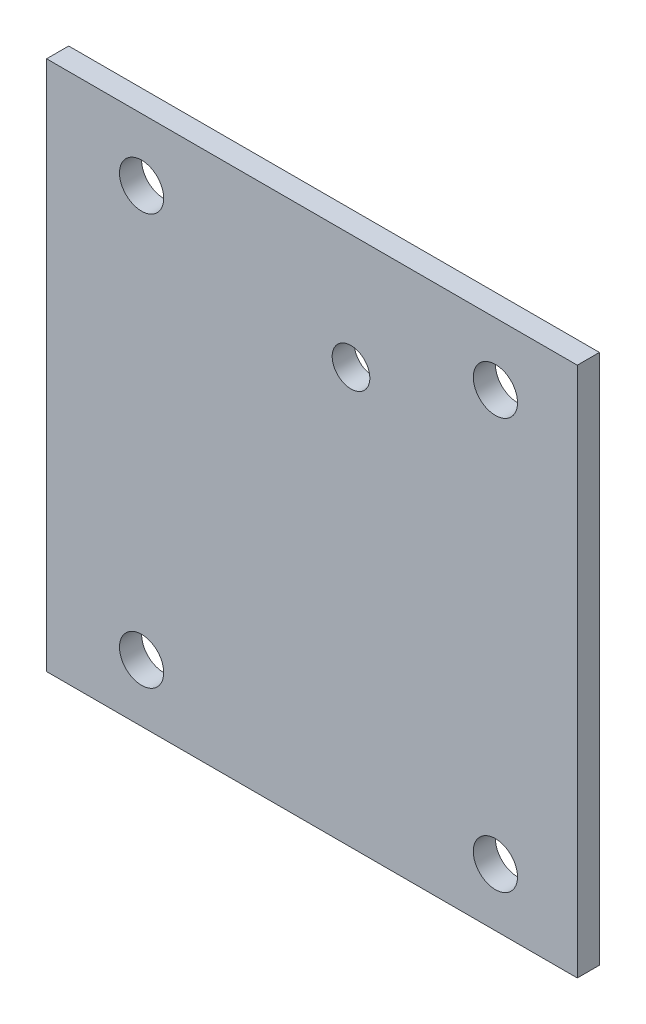
ISO-10303-21;
HEADER;
FILE_DESCRIPTION(('STEP AP214'),'2;1');
FILE_NAME('part.step','',(''),(''),'','','');
FILE_SCHEMA(('AUTOMOTIVE_DESIGN { 1 0 10303 214 1 1 1 1 }'));
ENDSEC;
DATA;
#1=APPLICATION_CONTEXT('core data for automotive mechanical design processes');
#2=APPLICATION_PROTOCOL_DEFINITION('international standard','automotive_design',2000,#1);
#3=PRODUCT_CONTEXT('',#1,'mechanical');
#4=PRODUCT('Part','Part','',(#3));
#5=PRODUCT_RELATED_PRODUCT_CATEGORY('part','',(#4));
#6=PRODUCT_DEFINITION_FORMATION('','',#4);
#7=PRODUCT_DEFINITION_CONTEXT('part definition',#1,'design');
#8=PRODUCT_DEFINITION('design','',#6,#7);
#9=PRODUCT_DEFINITION_SHAPE('','',#8);
#10=(LENGTH_UNIT() NAMED_UNIT(*) SI_UNIT(.MILLI.,.METRE.));
#11=(NAMED_UNIT(*) PLANE_ANGLE_UNIT() SI_UNIT($,.RADIAN.));
#12=(NAMED_UNIT(*) SI_UNIT($,.STERADIAN.) SOLID_ANGLE_UNIT());
#13=UNCERTAINTY_MEASURE_WITH_UNIT(LENGTH_MEASURE(1.E-05),#10,'distance_accuracy_value','');
#14=(GEOMETRIC_REPRESENTATION_CONTEXT(3) GLOBAL_UNCERTAINTY_ASSIGNED_CONTEXT((#13)) GLOBAL_UNIT_ASSIGNED_CONTEXT((#10,
#11,#12)) REPRESENTATION_CONTEXT('',''));
#15=CARTESIAN_POINT('',(0.,0.,0.));
#16=DIRECTION('',(0.,0.,1.));
#17=DIRECTION('',(1.,0.,0.));
#18=AXIS2_PLACEMENT_3D('',#15,#16,#17);
#19=CARTESIAN_POINT('',(0.,0.,3.175));
#20=DIRECTION('',(0.,0.,-1.));
#21=DIRECTION('',(-1.,0.,0.));
#22=AXIS2_PLACEMENT_3D('',#19,#20,#21);
#23=PLANE('',#22);
#24=CARTESIAN_POINT('',(55.467721899996,287.273383219132,3.175));
#25=DIRECTION('',(0.,0.,1.));
#26=DIRECTION('',(1.,0.,0.));
#27=AXIS2_PLACEMENT_3D('',#24,#25,#26);
#28=CIRCLE('',#27,2.7051);
#29=CARTESIAN_POINT('',(58.172821899996,287.273383219132,3.175));
#30=VERTEX_POINT('',#29);
#31=EDGE_CURVE('E144',#30,#30,#28,.T.);
#32=ORIENTED_EDGE('',*,*,#31,.F.);
#33=EDGE_LOOP('',(#32));
#34=FACE_BOUND('',#33,.T.);
#35=DIRECTION('',(0.,1.,0.));
#36=VECTOR('',#35,1.);
#37=CARTESIAN_POINT('',(87.9593052995791,303.776157482236,3.175));
#38=LINE('',#37,#36);
#39=CARTESIAN_POINT('',(87.9593052995791,227.576157482236,3.175));
#40=VERTEX_POINT('',#39);
#41=CARTESIAN_POINT('',(87.9593052995791,303.776157482236,3.175));
#42=VERTEX_POINT('',#41);
#43=EDGE_CURVE('E91',#40,#42,#38,.T.);
#44=ORIENTED_EDGE('',*,*,#43,.T.);
#45=DIRECTION('',(-1.,0.,0.));
#46=VECTOR('',#45,1.);
#47=CARTESIAN_POINT('',(87.9593052995791,303.776157482236,3.175));
#48=LINE('',#47,#46);
#49=CARTESIAN_POINT('',(11.7593052995791,303.776157482236,3.175));
#50=VERTEX_POINT('',#49);
#51=EDGE_CURVE('E86',#42,#50,#48,.T.);
#52=ORIENTED_EDGE('',*,*,#51,.T.);
#53=DIRECTION('',(0.,-1.,0.));
#54=VECTOR('',#53,1.);
#55=CARTESIAN_POINT('',(11.7593052995791,303.776157482236,3.175));
#56=LINE('',#55,#54);
#57=CARTESIAN_POINT('',(11.7593052995791,227.576157482236,3.175));
#58=VERTEX_POINT('',#57);
#59=EDGE_CURVE('E89',#50,#58,#56,.T.);
#60=ORIENTED_EDGE('',*,*,#59,.T.);
#61=DIRECTION('',(1.,0.,0.));
#62=VECTOR('',#61,1.);
#63=CARTESIAN_POINT('',(87.9593052995791,227.576157482236,3.175));
#64=LINE('',#63,#62);
#65=EDGE_CURVE('E56',#58,#40,#64,.T.);
#66=ORIENTED_EDGE('',*,*,#65,.T.);
#67=EDGE_LOOP('',(#44,#52,#60,#66));
#68=FACE_BOUND('',#67,.T.);
#69=CARTESIAN_POINT('',(25.3999999999992,235.857142857143,3.175));
#70=DIRECTION('',(0.,0.,1.));
#71=DIRECTION('',(1.,0.,0.));
#72=AXIS2_PLACEMENT_3D('',#69,#70,#71);
#73=CIRCLE('',#72,3.17500000000001);
#74=CARTESIAN_POINT('',(28.5749999999992,235.857142857143,3.175));
#75=VERTEX_POINT('',#74);
#76=EDGE_CURVE('E106',#75,#75,#73,.T.);
#77=ORIENTED_EDGE('',*,*,#76,.F.);
#78=EDGE_LOOP('',(#77));
#79=FACE_BOUND('',#78,.T.);
#80=CARTESIAN_POINT('',(25.399999999999,294.821428571429,3.175));
#81=DIRECTION('',(0.,0.,1.));
#82=DIRECTION('',(1.,0.,0.));
#83=AXIS2_PLACEMENT_3D('',#80,#81,#82);
#84=CIRCLE('',#83,3.17499999999996);
#85=CARTESIAN_POINT('',(28.5749999999989,294.821428571429,3.175));
#86=VERTEX_POINT('',#85);
#87=EDGE_CURVE('E121',#86,#86,#84,.T.);
#88=ORIENTED_EDGE('',*,*,#87,.F.);
#89=EDGE_LOOP('',(#88));
#90=FACE_BOUND('',#89,.T.);
#91=CARTESIAN_POINT('',(76.1999999999992,235.857142857144,3.175));
#92=DIRECTION('',(0.,0.,1.));
#93=DIRECTION('',(1.,0.,0.));
#94=AXIS2_PLACEMENT_3D('',#91,#92,#93);
#95=CIRCLE('',#94,3.175);
#96=CARTESIAN_POINT('',(79.3749999999992,235.857142857144,3.175));
#97=VERTEX_POINT('',#96);
#98=EDGE_CURVE('E127',#97,#97,#95,.T.);
#99=ORIENTED_EDGE('',*,*,#98,.F.);
#100=EDGE_LOOP('',(#99));
#101=FACE_BOUND('',#100,.T.);
#102=CARTESIAN_POINT('',(76.199999999999,294.821428571429,3.175));
#103=DIRECTION('',(0.,0.,1.));
#104=DIRECTION('',(1.,0.,0.));
#105=AXIS2_PLACEMENT_3D('',#102,#103,#104);
#106=CIRCLE('',#105,3.17499999999998);
#107=CARTESIAN_POINT('',(79.374999999999,294.821428571429,3.175));
#108=VERTEX_POINT('',#107);
#109=EDGE_CURVE('E133',#108,#108,#106,.T.);
#110=ORIENTED_EDGE('',*,*,#109,.F.);
#111=EDGE_LOOP('',(#110));
#112=FACE_BOUND('',#111,.T.);
#113=ADVANCED_FACE('F39',(#34,#68,#79,#90,#101,#112),#23,.F.);
#114=CARTESIAN_POINT('',(0.,0.,0.));
#115=DIRECTION('',(0.,0.,-1.));
#116=DIRECTION('',(-1.,0.,0.));
#117=AXIS2_PLACEMENT_3D('',#114,#115,#116);
#118=PLANE('',#117);
#119=CARTESIAN_POINT('',(55.467721899996,287.273383219132,0.));
#120=DIRECTION('',(0.,0.,1.));
#121=DIRECTION('',(1.,0.,0.));
#122=AXIS2_PLACEMENT_3D('',#119,#120,#121);
#123=CIRCLE('',#122,2.7051);
#124=CARTESIAN_POINT('',(58.172821899996,287.273383219132,0.));
#125=VERTEX_POINT('',#124);
#126=EDGE_CURVE('E139',#125,#125,#123,.T.);
#127=ORIENTED_EDGE('',*,*,#126,.T.);
#128=EDGE_LOOP('',(#127));
#129=FACE_BOUND('',#128,.T.);
#130=CARTESIAN_POINT('',(76.1999999999992,235.857142857144,0.));
#131=DIRECTION('',(0.,0.,1.));
#132=DIRECTION('',(1.,0.,0.));
#133=AXIS2_PLACEMENT_3D('',#130,#131,#132);
#134=CIRCLE('',#133,3.175);
#135=CARTESIAN_POINT('',(79.3749999999992,235.857142857144,0.));
#136=VERTEX_POINT('',#135);
#137=EDGE_CURVE('E130',#136,#136,#134,.T.);
#138=ORIENTED_EDGE('',*,*,#137,.T.);
#139=EDGE_LOOP('',(#138));
#140=FACE_BOUND('',#139,.T.);
#141=CARTESIAN_POINT('',(25.3999999999992,235.857142857143,0.));
#142=DIRECTION('',(0.,0.,1.));
#143=DIRECTION('',(1.,0.,0.));
#144=AXIS2_PLACEMENT_3D('',#141,#142,#143);
#145=CIRCLE('',#144,3.17500000000001);
#146=CARTESIAN_POINT('',(28.5749999999992,235.857142857143,0.));
#147=VERTEX_POINT('',#146);
#148=EDGE_CURVE('E118',#147,#147,#145,.T.);
#149=ORIENTED_EDGE('',*,*,#148,.T.);
#150=EDGE_LOOP('',(#149));
#151=FACE_BOUND('',#150,.T.);
#152=DIRECTION('',(0.,1.,0.));
#153=VECTOR('',#152,1.);
#154=CARTESIAN_POINT('',(87.9593052995791,303.776157482236,0.));
#155=LINE('',#154,#153);
#156=CARTESIAN_POINT('',(87.9593052995791,227.576157482236,0.));
#157=VERTEX_POINT('',#156);
#158=CARTESIAN_POINT('',(87.9593052995791,303.776157482236,0.));
#159=VERTEX_POINT('',#158);
#160=EDGE_CURVE('E103',#157,#159,#155,.T.);
#161=ORIENTED_EDGE('',*,*,#160,.F.);
#162=DIRECTION('',(1.,0.,0.));
#163=VECTOR('',#162,1.);
#164=CARTESIAN_POINT('',(87.9593052995791,227.576157482236,0.));
#165=LINE('',#164,#163);
#166=CARTESIAN_POINT('',(11.7593052995791,227.576157482236,0.));
#167=VERTEX_POINT('',#166);
#168=EDGE_CURVE('E79',#167,#157,#165,.T.);
#169=ORIENTED_EDGE('',*,*,#168,.F.);
#170=DIRECTION('',(0.,-1.,0.));
#171=VECTOR('',#170,1.);
#172=CARTESIAN_POINT('',(11.7593052995791,303.776157482236,0.));
#173=LINE('',#172,#171);
#174=CARTESIAN_POINT('',(11.7593052995791,303.776157482236,0.));
#175=VERTEX_POINT('',#174);
#176=EDGE_CURVE('E73',#175,#167,#173,.T.);
#177=ORIENTED_EDGE('',*,*,#176,.F.);
#178=DIRECTION('',(-1.,0.,0.));
#179=VECTOR('',#178,1.);
#180=CARTESIAN_POINT('',(87.9593052995791,303.776157482236,0.));
#181=LINE('',#180,#179);
#182=EDGE_CURVE('E95',#159,#175,#181,.T.);
#183=ORIENTED_EDGE('',*,*,#182,.F.);
#184=EDGE_LOOP('',(#161,#169,#177,#183));
#185=FACE_BOUND('',#184,.T.);
#186=CARTESIAN_POINT('',(25.399999999999,294.821428571429,0.));
#187=DIRECTION('',(0.,0.,1.));
#188=DIRECTION('',(1.,0.,0.));
#189=AXIS2_PLACEMENT_3D('',#186,#187,#188);
#190=CIRCLE('',#189,3.17499999999996);
#191=CARTESIAN_POINT('',(28.5749999999989,294.821428571429,0.));
#192=VERTEX_POINT('',#191);
#193=EDGE_CURVE('E124',#192,#192,#190,.T.);
#194=ORIENTED_EDGE('',*,*,#193,.T.);
#195=EDGE_LOOP('',(#194));
#196=FACE_BOUND('',#195,.T.);
#197=CARTESIAN_POINT('',(76.199999999999,294.821428571429,0.));
#198=DIRECTION('',(0.,0.,1.));
#199=DIRECTION('',(1.,0.,0.));
#200=AXIS2_PLACEMENT_3D('',#197,#198,#199);
#201=CIRCLE('',#200,3.17499999999998);
#202=CARTESIAN_POINT('',(79.374999999999,294.821428571429,0.));
#203=VERTEX_POINT('',#202);
#204=EDGE_CURVE('E136',#203,#203,#201,.T.);
#205=ORIENTED_EDGE('',*,*,#204,.T.);
#206=EDGE_LOOP('',(#205));
#207=FACE_BOUND('',#206,.T.);
#208=ADVANCED_FACE('F114',(#129,#140,#151,#185,#196,#207),#118,.T.);
#209=CARTESIAN_POINT('',(87.9593052995791,303.776157482236,3.175));
#210=DIRECTION('',(-1.,0.,0.));
#211=DIRECTION('',(0.,-1.,0.));
#212=AXIS2_PLACEMENT_3D('',#209,#210,#211);
#213=PLANE('',#212);
#214=ORIENTED_EDGE('',*,*,#160,.T.);
#215=DIRECTION('',(0.,0.,-1.));
#216=VECTOR('',#215,1.);
#217=CARTESIAN_POINT('',(87.9593052995791,303.776157482236,3.175));
#218=LINE('',#217,#216);
#219=EDGE_CURVE('E11',#42,#159,#218,.T.);
#220=ORIENTED_EDGE('',*,*,#219,.F.);
#221=ORIENTED_EDGE('',*,*,#43,.F.);
#222=DIRECTION('',(0.,0.,-1.));
#223=VECTOR('',#222,1.);
#224=CARTESIAN_POINT('',(87.9593052995791,227.576157482236,3.175));
#225=LINE('',#224,#223);
#226=EDGE_CURVE('E99',#40,#157,#225,.T.);
#227=ORIENTED_EDGE('',*,*,#226,.T.);
#228=EDGE_LOOP('',(#214,#220,#221,#227));
#229=FACE_BOUND('',#228,.T.);
#230=ADVANCED_FACE('F41',(#229),#213,.F.);
#231=CARTESIAN_POINT('',(87.9593052995791,303.776157482236,3.175));
#232=DIRECTION('',(0.,-1.,0.));
#233=DIRECTION('',(0.,0.,-1.));
#234=AXIS2_PLACEMENT_3D('',#231,#232,#233);
#235=PLANE('',#234);
#236=ORIENTED_EDGE('',*,*,#182,.T.);
#237=DIRECTION('',(0.,0.,-1.));
#238=VECTOR('',#237,1.);
#239=CARTESIAN_POINT('',(11.7593052995791,303.776157482236,3.175));
#240=LINE('',#239,#238);
#241=EDGE_CURVE('E48',#50,#175,#240,.T.);
#242=ORIENTED_EDGE('',*,*,#241,.F.);
#243=ORIENTED_EDGE('',*,*,#51,.F.);
#244=ORIENTED_EDGE('',*,*,#219,.T.);
#245=EDGE_LOOP('',(#236,#242,#243,#244));
#246=FACE_BOUND('',#245,.T.);
#247=ADVANCED_FACE('F94',(#246),#235,.F.);
#248=CARTESIAN_POINT('',(11.7593052995791,303.776157482236,3.175));
#249=DIRECTION('',(1.,0.,0.));
#250=DIRECTION('',(0.,1.,0.));
#251=AXIS2_PLACEMENT_3D('',#248,#249,#250);
#252=PLANE('',#251);
#253=ORIENTED_EDGE('',*,*,#176,.T.);
#254=DIRECTION('',(0.,0.,-1.));
#255=VECTOR('',#254,1.);
#256=CARTESIAN_POINT('',(11.7593052995791,227.576157482236,3.175));
#257=LINE('',#256,#255);
#258=EDGE_CURVE('E96',#58,#167,#257,.T.);
#259=ORIENTED_EDGE('',*,*,#258,.F.);
#260=ORIENTED_EDGE('',*,*,#59,.F.);
#261=ORIENTED_EDGE('',*,*,#241,.T.);
#262=EDGE_LOOP('',(#253,#259,#260,#261));
#263=FACE_BOUND('',#262,.T.);
#264=ADVANCED_FACE('F97',(#263),#252,.F.);
#265=CARTESIAN_POINT('',(87.9593052995791,227.576157482236,3.175));
#266=DIRECTION('',(0.,1.,0.));
#267=DIRECTION('',(0.,0.,1.));
#268=AXIS2_PLACEMENT_3D('',#265,#266,#267);
#269=PLANE('',#268);
#270=ORIENTED_EDGE('',*,*,#168,.T.);
#271=ORIENTED_EDGE('',*,*,#226,.F.);
#272=ORIENTED_EDGE('',*,*,#65,.F.);
#273=ORIENTED_EDGE('',*,*,#258,.T.);
#274=EDGE_LOOP('',(#270,#271,#272,#273));
#275=FACE_BOUND('',#274,.T.);
#276=ADVANCED_FACE('F111',(#275),#269,.F.);
#277=CARTESIAN_POINT('',(25.3999999999992,235.857142857143,3.175));
#278=DIRECTION('',(0.,0.,-1.));
#279=DIRECTION('',(-1.,0.,0.));
#280=AXIS2_PLACEMENT_3D('',#277,#278,#279);
#281=CYLINDRICAL_SURFACE('',#280,3.17500000000001);
#282=ORIENTED_EDGE('',*,*,#76,.T.);
#283=EDGE_LOOP('',(#282));
#284=FACE_BOUND('',#283,.T.);
#285=ORIENTED_EDGE('',*,*,#148,.F.);
#286=EDGE_LOOP('',(#285));
#287=FACE_BOUND('',#286,.T.);
#288=ADVANCED_FACE('F159',(#284,#287),#281,.F.);
#289=CARTESIAN_POINT('',(25.399999999999,294.821428571429,3.175));
#290=DIRECTION('',(0.,0.,-1.));
#291=DIRECTION('',(-1.,0.,0.));
#292=AXIS2_PLACEMENT_3D('',#289,#290,#291);
#293=CYLINDRICAL_SURFACE('',#292,3.17499999999996);
#294=ORIENTED_EDGE('',*,*,#87,.T.);
#295=EDGE_LOOP('',(#294));
#296=FACE_BOUND('',#295,.T.);
#297=ORIENTED_EDGE('',*,*,#193,.F.);
#298=EDGE_LOOP('',(#297));
#299=FACE_BOUND('',#298,.T.);
#300=ADVANCED_FACE('F201',(#296,#299),#293,.F.);
#301=CARTESIAN_POINT('',(76.1999999999992,235.857142857144,3.175));
#302=DIRECTION('',(0.,0.,-1.));
#303=DIRECTION('',(-1.,0.,0.));
#304=AXIS2_PLACEMENT_3D('',#301,#302,#303);
#305=CYLINDRICAL_SURFACE('',#304,3.175);
#306=ORIENTED_EDGE('',*,*,#98,.T.);
#307=EDGE_LOOP('',(#306));
#308=FACE_BOUND('',#307,.T.);
#309=ORIENTED_EDGE('',*,*,#137,.F.);
#310=EDGE_LOOP('',(#309));
#311=FACE_BOUND('',#310,.T.);
#312=ADVANCED_FACE('F210',(#308,#311),#305,.F.);
#313=CARTESIAN_POINT('',(76.199999999999,294.821428571429,3.175));
#314=DIRECTION('',(0.,0.,-1.));
#315=DIRECTION('',(-1.,0.,0.));
#316=AXIS2_PLACEMENT_3D('',#313,#314,#315);
#317=CYLINDRICAL_SURFACE('',#316,3.17499999999998);
#318=ORIENTED_EDGE('',*,*,#109,.T.);
#319=EDGE_LOOP('',(#318));
#320=FACE_BOUND('',#319,.T.);
#321=ORIENTED_EDGE('',*,*,#204,.F.);
#322=EDGE_LOOP('',(#321));
#323=FACE_BOUND('',#322,.T.);
#324=ADVANCED_FACE('F219',(#320,#323),#317,.F.);
#325=CARTESIAN_POINT('',(55.467721899996,287.273383219132,3.175));
#326=DIRECTION('',(0.,0.,1.));
#327=DIRECTION('',(1.,0.,0.));
#328=AXIS2_PLACEMENT_3D('',#325,#326,#327);
#329=CYLINDRICAL_SURFACE('',#328,2.7051);
#330=ORIENTED_EDGE('',*,*,#126,.F.);
#331=EDGE_LOOP('',(#330));
#332=FACE_BOUND('',#331,.T.);
#333=ORIENTED_EDGE('',*,*,#31,.T.);
#334=EDGE_LOOP('',(#333));
#335=FACE_BOUND('',#334,.T.);
#336=ADVANCED_FACE('F148',(#332,#335),#329,.F.);
#337=CLOSED_SHELL('',(#113,#208,#230,#247,#264,#276,#288,#300,#312,#324,#336));
#338=MANIFOLD_SOLID_BREP('B2',#337);
#339=ADVANCED_BREP_SHAPE_REPRESENTATION('',(#18,#338),#14);
#340=SHAPE_DEFINITION_REPRESENTATION(#9,#339);
ENDSEC;
END-ISO-10303-21;
